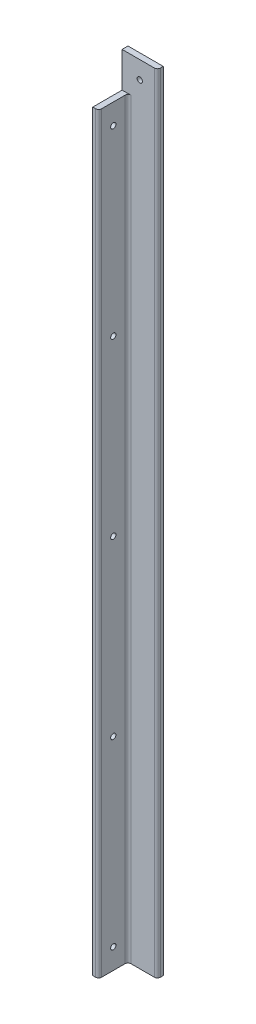
ISO-10303-21;
HEADER;
FILE_DESCRIPTION(('STEP AP214'),'2;1');
FILE_NAME('part.step','',(''),(''),'','','');
FILE_SCHEMA(('AUTOMOTIVE_DESIGN { 1 0 10303 214 1 1 1 1 }'));
ENDSEC;
DATA;
#1=APPLICATION_CONTEXT('core data for automotive mechanical design processes');
#2=APPLICATION_PROTOCOL_DEFINITION('international standard','automotive_design',2000,#1);
#3=PRODUCT_CONTEXT('',#1,'mechanical');
#4=PRODUCT('Part','Part','',(#3));
#5=PRODUCT_RELATED_PRODUCT_CATEGORY('part','',(#4));
#6=PRODUCT_DEFINITION_FORMATION('','',#4);
#7=PRODUCT_DEFINITION_CONTEXT('part definition',#1,'design');
#8=PRODUCT_DEFINITION('design','',#6,#7);
#9=PRODUCT_DEFINITION_SHAPE('','',#8);
#10=(LENGTH_UNIT() NAMED_UNIT(*) SI_UNIT(.MILLI.,.METRE.));
#11=(NAMED_UNIT(*) PLANE_ANGLE_UNIT() SI_UNIT($,.RADIAN.));
#12=(NAMED_UNIT(*) SI_UNIT($,.STERADIAN.) SOLID_ANGLE_UNIT());
#13=UNCERTAINTY_MEASURE_WITH_UNIT(LENGTH_MEASURE(1.E-05),#10,'distance_accuracy_value','');
#14=(GEOMETRIC_REPRESENTATION_CONTEXT(3) GLOBAL_UNCERTAINTY_ASSIGNED_CONTEXT((#13)) GLOBAL_UNIT_ASSIGNED_CONTEXT((#10,
#11,#12)) REPRESENTATION_CONTEXT('',''));
#15=CARTESIAN_POINT('',(0.,0.,0.));
#16=DIRECTION('',(0.,0.,1.));
#17=DIRECTION('',(1.,0.,0.));
#18=AXIS2_PLACEMENT_3D('',#15,#16,#17);
#19=CARTESIAN_POINT('',(0.,431.8,5.08));
#20=DIRECTION('',(1.,0.,0.));
#21=DIRECTION('',(0.,0.,1.));
#22=AXIS2_PLACEMENT_3D('',#19,#20,#21);
#23=PLANE('',#22);
#24=CARTESIAN_POINT('',(0.,109.5375,16.1925));
#25=DIRECTION('',(-1.,0.,0.));
#26=DIRECTION('',(0.,0.,1.));
#27=AXIS2_PLACEMENT_3D('',#24,#25,#26);
#28=CIRCLE('',#27,1.4224);
#29=CARTESIAN_POINT('',(0.,109.5375,17.6149));
#30=VERTEX_POINT('',#29);
#31=EDGE_CURVE('E155',#30,#30,#28,.T.);
#32=ORIENTED_EDGE('',*,*,#31,.F.);
#33=EDGE_LOOP('',(#32));
#34=FACE_BOUND('',#33,.T.);
#35=CARTESIAN_POINT('',(0.,395.2875,16.1925));
#36=DIRECTION('',(-1.,0.,0.));
#37=DIRECTION('',(0.,0.,1.));
#38=AXIS2_PLACEMENT_3D('',#35,#36,#37);
#39=CIRCLE('',#38,1.42239999999999);
#40=CARTESIAN_POINT('',(0.,395.2875,17.6149));
#41=VERTEX_POINT('',#40);
#42=EDGE_CURVE('E158',#41,#41,#39,.T.);
#43=ORIENTED_EDGE('',*,*,#42,.F.);
#44=EDGE_LOOP('',(#43));
#45=FACE_BOUND('',#44,.T.);
#46=CARTESIAN_POINT('',(0.,11.1125,16.1925));
#47=DIRECTION('',(-1.,0.,0.));
#48=DIRECTION('',(0.,0.,1.));
#49=AXIS2_PLACEMENT_3D('',#46,#47,#48);
#50=CIRCLE('',#49,1.4224);
#51=CARTESIAN_POINT('',(0.,11.1125,17.6149));
#52=VERTEX_POINT('',#51);
#53=EDGE_CURVE('E161',#52,#52,#50,.T.);
#54=ORIENTED_EDGE('',*,*,#53,.F.);
#55=EDGE_LOOP('',(#54));
#56=FACE_BOUND('',#55,.T.);
#57=CARTESIAN_POINT('',(0.,296.8625,16.1925));
#58=DIRECTION('',(-1.,0.,0.));
#59=DIRECTION('',(0.,0.,1.));
#60=AXIS2_PLACEMENT_3D('',#57,#58,#59);
#61=CIRCLE('',#60,1.42239999999999);
#62=CARTESIAN_POINT('',(0.,296.8625,17.6149));
#63=VERTEX_POINT('',#62);
#64=EDGE_CURVE('E164',#63,#63,#61,.T.);
#65=ORIENTED_EDGE('',*,*,#64,.F.);
#66=EDGE_LOOP('',(#65));
#67=FACE_BOUND('',#66,.T.);
#68=CARTESIAN_POINT('',(0.,203.2,16.1925));
#69=DIRECTION('',(-1.,0.,0.));
#70=DIRECTION('',(0.,0.,1.));
#71=AXIS2_PLACEMENT_3D('',#68,#69,#70);
#72=CIRCLE('',#71,1.4224);
#73=CARTESIAN_POINT('',(0.,203.2,17.6149));
#74=VERTEX_POINT('',#73);
#75=EDGE_CURVE('E167',#74,#74,#72,.T.);
#76=ORIENTED_EDGE('',*,*,#75,.F.);
#77=EDGE_LOOP('',(#76));
#78=FACE_BOUND('',#77,.T.);
#79=DIRECTION('',(0.,0.,-1.));
#80=VECTOR('',#79,1.);
#81=CARTESIAN_POINT('',(0.,425.45,8.255));
#82=LINE('',#81,#80);
#83=CARTESIAN_POINT('',(0.,425.45,8.255));
#84=VERTEX_POINT('',#83);
#85=CARTESIAN_POINT('',(0.,425.45,5.08));
#86=VERTEX_POINT('',#85);
#87=EDGE_CURVE('E118',#84,#86,#82,.T.);
#88=ORIENTED_EDGE('',*,*,#87,.T.);
#89=DIRECTION('',(0.,-1.,0.));
#90=VECTOR('',#89,1.);
#91=CARTESIAN_POINT('',(0.,431.8,5.08));
#92=LINE('',#91,#90);
#93=CARTESIAN_POINT('',(0.,0.,5.08));
#94=VERTEX_POINT('',#93);
#95=EDGE_CURVE('E11',#86,#94,#92,.T.);
#96=ORIENTED_EDGE('',*,*,#95,.T.);
#97=DIRECTION('',(0.,0.,-1.));
#98=VECTOR('',#97,1.);
#99=CARTESIAN_POINT('',(0.,0.,5.08));
#100=LINE('',#99,#98);
#101=CARTESIAN_POINT('',(0.,0.,24.13));
#102=VERTEX_POINT('',#101);
#103=EDGE_CURVE('E180',#102,#94,#100,.T.);
#104=ORIENTED_EDGE('',*,*,#103,.F.);
#105=DIRECTION('',(0.,-1.,0.));
#106=VECTOR('',#105,1.);
#107=CARTESIAN_POINT('',(0.,431.8,24.13));
#108=LINE('',#107,#106);
#109=CARTESIAN_POINT('',(0.,406.4,24.13));
#110=VERTEX_POINT('',#109);
#111=EDGE_CURVE('E203',#110,#102,#108,.T.);
#112=ORIENTED_EDGE('',*,*,#111,.F.);
#113=DIRECTION('',(0.,0.,1.));
#114=VECTOR('',#113,1.);
#115=CARTESIAN_POINT('',(0.,406.4,5.08));
#116=LINE('',#115,#114);
#117=CARTESIAN_POINT('',(0.,406.4,8.255));
#118=VERTEX_POINT('',#117);
#119=EDGE_CURVE('E125',#118,#110,#116,.T.);
#120=ORIENTED_EDGE('',*,*,#119,.F.);
#121=DIRECTION('',(0.,-1.,0.));
#122=VECTOR('',#121,1.);
#123=CARTESIAN_POINT('',(0.,431.8,8.255));
#124=LINE('',#123,#122);
#125=EDGE_CURVE('E113',#84,#118,#124,.T.);
#126=ORIENTED_EDGE('',*,*,#125,.F.);
#127=EDGE_LOOP('',(#88,#96,#104,#112,#120,#126));
#128=FACE_BOUND('',#127,.T.);
#129=ADVANCED_FACE('F34',(#34,#45,#56,#67,#78,#128),#23,.F.);
#130=CARTESIAN_POINT('',(0.,431.8,5.08));
#131=DIRECTION('',(0.,0.,1.));
#132=DIRECTION('',(-1.,0.,0.));
#133=AXIS2_PLACEMENT_3D('',#130,#131,#132);
#134=PLANE('',#133);
#135=CARTESIAN_POINT('',(9.525,415.925,5.08));
#136=DIRECTION('',(0.,0.,-1.));
#137=DIRECTION('',(-1.,0.,0.));
#138=AXIS2_PLACEMENT_3D('',#135,#136,#137);
#139=CIRCLE('',#138,1.42239999999999);
#140=CARTESIAN_POINT('',(8.10260000000001,415.925,5.08));
#141=VERTEX_POINT('',#140);
#142=EDGE_CURVE('E242',#141,#141,#139,.T.);
#143=ORIENTED_EDGE('',*,*,#142,.F.);
#144=EDGE_LOOP('',(#143));
#145=FACE_BOUND('',#144,.T.);
#146=DIRECTION('',(1.,0.,0.));
#147=VECTOR('',#146,1.);
#148=CARTESIAN_POINT('',(0.,425.45,5.08));
#149=LINE('',#148,#147);
#150=CARTESIAN_POINT('',(19.05,425.45,5.08));
#151=VERTEX_POINT('',#150);
#152=EDGE_CURVE('E131',#86,#151,#149,.T.);
#153=ORIENTED_EDGE('',*,*,#152,.T.);
#154=DIRECTION('',(0.,-1.,0.));
#155=VECTOR('',#154,1.);
#156=CARTESIAN_POINT('',(19.05,431.8,5.08));
#157=LINE('',#156,#155);
#158=CARTESIAN_POINT('',(19.05,0.,5.08));
#159=VERTEX_POINT('',#158);
#160=EDGE_CURVE('E41',#151,#159,#157,.T.);
#161=ORIENTED_EDGE('',*,*,#160,.T.);
#162=DIRECTION('',(1.,0.,0.));
#163=VECTOR('',#162,1.);
#164=CARTESIAN_POINT('',(0.,0.,5.08));
#165=LINE('',#164,#163);
#166=EDGE_CURVE('E182',#94,#159,#165,.T.);
#167=ORIENTED_EDGE('',*,*,#166,.F.);
#168=ORIENTED_EDGE('',*,*,#95,.F.);
#169=EDGE_LOOP('',(#153,#161,#167,#168));
#170=FACE_BOUND('',#169,.T.);
#171=ADVANCED_FACE('F223',(#145,#170),#134,.F.);
#172=CARTESIAN_POINT('',(19.05,431.8,6.66749999999999));
#173=DIRECTION('',(-1.,0.,0.));
#174=DIRECTION('',(0.,0.,-1.));
#175=AXIS2_PLACEMENT_3D('',#172,#173,#174);
#176=PLANE('',#175);
#177=DIRECTION('',(0.,0.,1.));
#178=VECTOR('',#177,1.);
#179=CARTESIAN_POINT('',(19.05,425.45,5.08));
#180=LINE('',#179,#178);
#181=CARTESIAN_POINT('',(19.05,425.45,6.66749999999999));
#182=VERTEX_POINT('',#181);
#183=EDGE_CURVE('E134',#151,#182,#180,.T.);
#184=ORIENTED_EDGE('',*,*,#183,.T.);
#185=DIRECTION('',(0.,-1.,0.));
#186=VECTOR('',#185,1.);
#187=CARTESIAN_POINT('',(19.05,431.8,6.66749999999999));
#188=LINE('',#187,#186);
#189=CARTESIAN_POINT('',(19.05,0.,6.66749999999999));
#190=VERTEX_POINT('',#189);
#191=EDGE_CURVE('E218',#182,#190,#188,.T.);
#192=ORIENTED_EDGE('',*,*,#191,.T.);
#193=DIRECTION('',(0.,0.,1.));
#194=VECTOR('',#193,1.);
#195=CARTESIAN_POINT('',(19.05,0.,6.66749999999999));
#196=LINE('',#195,#194);
#197=EDGE_CURVE('E185',#159,#190,#196,.T.);
#198=ORIENTED_EDGE('',*,*,#197,.F.);
#199=ORIENTED_EDGE('',*,*,#160,.F.);
#200=EDGE_LOOP('',(#184,#192,#198,#199));
#201=FACE_BOUND('',#200,.T.);
#202=ADVANCED_FACE('F225',(#201),#176,.F.);
#203=CARTESIAN_POINT('',(17.4625,431.8,6.6675));
#204=DIRECTION('',(0.,-1.,0.));
#205=DIRECTION('',(0.,0.,1.));
#206=AXIS2_PLACEMENT_3D('',#203,#204,#205);
#207=CYLINDRICAL_SURFACE('',#206,1.5875);
#208=CARTESIAN_POINT('',(17.4625,425.45,6.6675));
#209=DIRECTION('',(0.,-1.,0.));
#210=DIRECTION('',(0.,0.,-1.));
#211=AXIS2_PLACEMENT_3D('',#208,#209,#210);
#212=CIRCLE('',#211,1.5875);
#213=CARTESIAN_POINT('',(17.4625,425.45,8.255));
#214=VERTEX_POINT('',#213);
#215=EDGE_CURVE('E119',#182,#214,#212,.T.);
#216=ORIENTED_EDGE('',*,*,#215,.T.);
#217=DIRECTION('',(0.,-1.,0.));
#218=VECTOR('',#217,1.);
#219=CARTESIAN_POINT('',(17.4625,431.8,8.255));
#220=LINE('',#219,#218);
#221=CARTESIAN_POINT('',(17.4625,0.,8.255));
#222=VERTEX_POINT('',#221);
#223=EDGE_CURVE('E116',#214,#222,#220,.T.);
#224=ORIENTED_EDGE('',*,*,#223,.T.);
#225=CARTESIAN_POINT('',(17.4625,0.,6.6675));
#226=DIRECTION('',(0.,-1.,0.));
#227=DIRECTION('',(0.,0.,1.));
#228=AXIS2_PLACEMENT_3D('',#225,#226,#227);
#229=CIRCLE('',#228,1.5875);
#230=EDGE_CURVE('E188',#190,#222,#229,.T.);
#231=ORIENTED_EDGE('',*,*,#230,.F.);
#232=ORIENTED_EDGE('',*,*,#191,.F.);
#233=EDGE_LOOP('',(#216,#224,#231,#232));
#234=FACE_BOUND('',#233,.T.);
#235=ADVANCED_FACE('F241',(#234),#207,.T.);
#236=CARTESIAN_POINT('',(4.76250000000001,431.8,8.255));
#237=DIRECTION('',(0.,0.,-1.));
#238=DIRECTION('',(1.,0.,0.));
#239=AXIS2_PLACEMENT_3D('',#236,#237,#238);
#240=PLANE('',#239);
#241=CARTESIAN_POINT('',(9.525,415.925,8.255));
#242=DIRECTION('',(0.,0.,-1.));
#243=DIRECTION('',(-1.,0.,0.));
#244=AXIS2_PLACEMENT_3D('',#241,#242,#243);
#245=CIRCLE('',#244,1.42239999999999);
#246=CARTESIAN_POINT('',(8.10260000000001,415.925,8.255));
#247=VERTEX_POINT('',#246);
#248=EDGE_CURVE('E244',#247,#247,#245,.T.);
#249=ORIENTED_EDGE('',*,*,#248,.T.);
#250=EDGE_LOOP('',(#249));
#251=FACE_BOUND('',#250,.T.);
#252=DIRECTION('',(-1.,0.,0.));
#253=VECTOR('',#252,1.);
#254=CARTESIAN_POINT('',(17.4625,425.45,8.255));
#255=LINE('',#254,#253);
#256=EDGE_CURVE('E48',#214,#84,#255,.T.);
#257=ORIENTED_EDGE('',*,*,#256,.T.);
#258=ORIENTED_EDGE('',*,*,#125,.T.);
#259=DIRECTION('',(1.,0.,0.));
#260=VECTOR('',#259,1.);
#261=CARTESIAN_POINT('',(-3.175,406.4,8.255));
#262=LINE('',#261,#260);
#263=CARTESIAN_POINT('',(4.7625,406.4,8.255));
#264=VERTEX_POINT('',#263);
#265=EDGE_CURVE('E175',#118,#264,#262,.T.);
#266=ORIENTED_EDGE('',*,*,#265,.T.);
#267=DIRECTION('',(0.,-1.,0.));
#268=VECTOR('',#267,1.);
#269=CARTESIAN_POINT('',(4.76250000000001,431.8,8.255));
#270=LINE('',#269,#268);
#271=CARTESIAN_POINT('',(4.76250000000001,0.,8.255));
#272=VERTEX_POINT('',#271);
#273=EDGE_CURVE('E214',#264,#272,#270,.T.);
#274=ORIENTED_EDGE('',*,*,#273,.T.);
#275=DIRECTION('',(-1.,0.,0.));
#276=VECTOR('',#275,1.);
#277=CARTESIAN_POINT('',(4.76250000000001,0.,8.255));
#278=LINE('',#277,#276);
#279=EDGE_CURVE('E191',#222,#272,#278,.T.);
#280=ORIENTED_EDGE('',*,*,#279,.F.);
#281=ORIENTED_EDGE('',*,*,#223,.F.);
#282=EDGE_LOOP('',(#257,#258,#266,#274,#280,#281));
#283=FACE_BOUND('',#282,.T.);
#284=ADVANCED_FACE('F111',(#251,#283),#240,.F.);
#285=CARTESIAN_POINT('',(4.7625,431.8,9.8425));
#286=DIRECTION('',(0.,-1.,0.));
#287=DIRECTION('',(0.,0.,1.));
#288=AXIS2_PLACEMENT_3D('',#285,#286,#287);
#289=CYLINDRICAL_SURFACE('',#288,1.5875);
#290=DIRECTION('',(0.,-1.,0.));
#291=VECTOR('',#290,1.);
#292=CARTESIAN_POINT('',(3.175,431.8,9.84250000000001));
#293=LINE('',#292,#291);
#294=CARTESIAN_POINT('',(3.175,406.4,9.84250000000001));
#295=VERTEX_POINT('',#294);
#296=CARTESIAN_POINT('',(3.175,0.,9.84250000000001));
#297=VERTEX_POINT('',#296);
#298=EDGE_CURVE('E211',#295,#297,#293,.T.);
#299=ORIENTED_EDGE('',*,*,#298,.T.);
#300=CARTESIAN_POINT('',(4.7625,0.,9.8425));
#301=DIRECTION('',(0.,1.,0.));
#302=DIRECTION('',(0.,0.,-1.));
#303=AXIS2_PLACEMENT_3D('',#300,#301,#302);
#304=CIRCLE('',#303,1.5875);
#305=EDGE_CURVE('E194',#272,#297,#304,.T.);
#306=ORIENTED_EDGE('',*,*,#305,.F.);
#307=ORIENTED_EDGE('',*,*,#273,.F.);
#308=CARTESIAN_POINT('',(4.7625,406.4,9.8425));
#309=DIRECTION('',(0.,1.,0.));
#310=DIRECTION('',(0.,0.,1.));
#311=AXIS2_PLACEMENT_3D('',#308,#309,#310);
#312=CIRCLE('',#311,1.5875);
#313=EDGE_CURVE('E170',#295,#264,#312,.F.);
#314=ORIENTED_EDGE('',*,*,#313,.F.);
#315=EDGE_LOOP('',(#299,#306,#307,#314));
#316=FACE_BOUND('',#315,.T.);
#317=ADVANCED_FACE('F238',(#316),#289,.F.);
#318=CARTESIAN_POINT('',(3.175,431.8,9.84250000000001));
#319=DIRECTION('',(-1.,0.,0.));
#320=DIRECTION('',(0.,0.,-1.));
#321=AXIS2_PLACEMENT_3D('',#318,#319,#320);
#322=PLANE('',#321);
#323=CARTESIAN_POINT('',(3.175,203.2,16.1925));
#324=DIRECTION('',(-1.,0.,0.));
#325=DIRECTION('',(0.,0.,1.));
#326=AXIS2_PLACEMENT_3D('',#323,#324,#325);
#327=CIRCLE('',#326,1.4224);
#328=CARTESIAN_POINT('',(3.175,203.2,17.6149));
#329=VERTEX_POINT('',#328);
#330=EDGE_CURVE('E147',#329,#329,#327,.T.);
#331=ORIENTED_EDGE('',*,*,#330,.T.);
#332=EDGE_LOOP('',(#331));
#333=FACE_BOUND('',#332,.T.);
#334=CARTESIAN_POINT('',(3.175,296.8625,16.1925));
#335=DIRECTION('',(-1.,0.,0.));
#336=DIRECTION('',(0.,0.,1.));
#337=AXIS2_PLACEMENT_3D('',#334,#335,#336);
#338=CIRCLE('',#337,1.42239999999999);
#339=CARTESIAN_POINT('',(3.175,296.8625,17.6149));
#340=VERTEX_POINT('',#339);
#341=EDGE_CURVE('E144',#340,#340,#338,.T.);
#342=ORIENTED_EDGE('',*,*,#341,.T.);
#343=EDGE_LOOP('',(#342));
#344=FACE_BOUND('',#343,.T.);
#345=CARTESIAN_POINT('',(3.175,11.1125,16.1925));
#346=DIRECTION('',(-1.,0.,0.));
#347=DIRECTION('',(0.,0.,1.));
#348=AXIS2_PLACEMENT_3D('',#345,#346,#347);
#349=CIRCLE('',#348,1.4224);
#350=CARTESIAN_POINT('',(3.175,11.1125,17.6149));
#351=VERTEX_POINT('',#350);
#352=EDGE_CURVE('E141',#351,#351,#349,.T.);
#353=ORIENTED_EDGE('',*,*,#352,.T.);
#354=EDGE_LOOP('',(#353));
#355=FACE_BOUND('',#354,.T.);
#356=CARTESIAN_POINT('',(3.175,395.2875,16.1925));
#357=DIRECTION('',(-1.,0.,0.));
#358=DIRECTION('',(0.,0.,1.));
#359=AXIS2_PLACEMENT_3D('',#356,#357,#358);
#360=CIRCLE('',#359,1.42239999999999);
#361=CARTESIAN_POINT('',(3.175,395.2875,17.6149));
#362=VERTEX_POINT('',#361);
#363=EDGE_CURVE('E140',#362,#362,#360,.T.);
#364=ORIENTED_EDGE('',*,*,#363,.T.);
#365=EDGE_LOOP('',(#364));
#366=FACE_BOUND('',#365,.T.);
#367=CARTESIAN_POINT('',(3.175,109.5375,16.1925));
#368=DIRECTION('',(-1.,0.,0.));
#369=DIRECTION('',(0.,0.,1.));
#370=AXIS2_PLACEMENT_3D('',#367,#368,#369);
#371=CIRCLE('',#370,1.4224);
#372=CARTESIAN_POINT('',(3.175,109.5375,17.6149));
#373=VERTEX_POINT('',#372);
#374=EDGE_CURVE('E150',#373,#373,#371,.T.);
#375=ORIENTED_EDGE('',*,*,#374,.T.);
#376=EDGE_LOOP('',(#375));
#377=FACE_BOUND('',#376,.T.);
#378=DIRECTION('',(0.,-1.,0.));
#379=VECTOR('',#378,1.);
#380=CARTESIAN_POINT('',(3.175,431.8,22.5425));
#381=LINE('',#380,#379);
#382=CARTESIAN_POINT('',(3.175,406.4,22.5425));
#383=VERTEX_POINT('',#382);
#384=CARTESIAN_POINT('',(3.175,0.,22.5425));
#385=VERTEX_POINT('',#384);
#386=EDGE_CURVE('E208',#383,#385,#381,.T.);
#387=ORIENTED_EDGE('',*,*,#386,.T.);
#388=DIRECTION('',(0.,0.,1.));
#389=VECTOR('',#388,1.);
#390=CARTESIAN_POINT('',(3.175,0.,9.84250000000001));
#391=LINE('',#390,#389);
#392=EDGE_CURVE('E197',#297,#385,#391,.T.);
#393=ORIENTED_EDGE('',*,*,#392,.F.);
#394=ORIENTED_EDGE('',*,*,#298,.F.);
#395=DIRECTION('',(0.,0.,1.));
#396=VECTOR('',#395,1.);
#397=CARTESIAN_POINT('',(3.175,406.4,24.13));
#398=LINE('',#397,#396);
#399=EDGE_CURVE('E172',#295,#383,#398,.T.);
#400=ORIENTED_EDGE('',*,*,#399,.T.);
#401=EDGE_LOOP('',(#387,#393,#394,#400));
#402=FACE_BOUND('',#401,.T.);
#403=ADVANCED_FACE('F271',(#333,#344,#355,#366,#377,#402),#322,.F.);
#404=CARTESIAN_POINT('',(1.5875,431.8,22.5425));
#405=DIRECTION('',(0.,-1.,0.));
#406=DIRECTION('',(0.,0.,1.));
#407=AXIS2_PLACEMENT_3D('',#404,#405,#406);
#408=CYLINDRICAL_SURFACE('',#407,1.5875);
#409=DIRECTION('',(0.,-1.,0.));
#410=VECTOR('',#409,1.);
#411=CARTESIAN_POINT('',(1.58749999999999,431.8,24.13));
#412=LINE('',#411,#410);
#413=CARTESIAN_POINT('',(1.58749999999999,406.4,24.13));
#414=VERTEX_POINT('',#413);
#415=CARTESIAN_POINT('',(1.58749999999999,0.,24.13));
#416=VERTEX_POINT('',#415);
#417=EDGE_CURVE('E205',#414,#416,#412,.T.);
#418=ORIENTED_EDGE('',*,*,#417,.T.);
#419=CARTESIAN_POINT('',(1.5875,0.,22.5425));
#420=DIRECTION('',(0.,-1.,0.));
#421=DIRECTION('',(0.,0.,-1.));
#422=AXIS2_PLACEMENT_3D('',#419,#420,#421);
#423=CIRCLE('',#422,1.5875);
#424=EDGE_CURVE('E200',#385,#416,#423,.T.);
#425=ORIENTED_EDGE('',*,*,#424,.F.);
#426=ORIENTED_EDGE('',*,*,#386,.F.);
#427=CARTESIAN_POINT('',(1.5875,406.4,22.5425));
#428=DIRECTION('',(0.,1.,0.));
#429=DIRECTION('',(0.,0.,1.));
#430=AXIS2_PLACEMENT_3D('',#427,#428,#429);
#431=CIRCLE('',#430,1.5875);
#432=EDGE_CURVE('E126',#414,#383,#431,.T.);
#433=ORIENTED_EDGE('',*,*,#432,.F.);
#434=EDGE_LOOP('',(#418,#425,#426,#433));
#435=FACE_BOUND('',#434,.T.);
#436=ADVANCED_FACE('F274',(#435),#408,.T.);
#437=CARTESIAN_POINT('',(0.,431.8,24.13));
#438=DIRECTION('',(0.,0.,-1.));
#439=DIRECTION('',(1.,0.,0.));
#440=AXIS2_PLACEMENT_3D('',#437,#438,#439);
#441=PLANE('',#440);
#442=ORIENTED_EDGE('',*,*,#111,.T.);
#443=DIRECTION('',(-1.,0.,0.));
#444=VECTOR('',#443,1.);
#445=CARTESIAN_POINT('',(0.,0.,24.13));
#446=LINE('',#445,#444);
#447=EDGE_CURVE('E56',#416,#102,#446,.T.);
#448=ORIENTED_EDGE('',*,*,#447,.F.);
#449=ORIENTED_EDGE('',*,*,#417,.F.);
#450=DIRECTION('',(1.,0.,0.));
#451=VECTOR('',#450,1.);
#452=CARTESIAN_POINT('',(-3.175,406.4,24.13));
#453=LINE('',#452,#451);
#454=EDGE_CURVE('E127',#110,#414,#453,.T.);
#455=ORIENTED_EDGE('',*,*,#454,.F.);
#456=EDGE_LOOP('',(#442,#448,#449,#455));
#457=FACE_BOUND('',#456,.T.);
#458=ADVANCED_FACE('F230',(#457),#441,.F.);
#459=CARTESIAN_POINT('',(1.5875,0.,22.5425));
#460=DIRECTION('',(0.,1.,0.));
#461=DIRECTION('',(0.,0.,-1.));
#462=AXIS2_PLACEMENT_3D('',#459,#460,#461);
#463=PLANE('',#462);
#464=ORIENTED_EDGE('',*,*,#103,.T.);
#465=ORIENTED_EDGE('',*,*,#166,.T.);
#466=ORIENTED_EDGE('',*,*,#197,.T.);
#467=ORIENTED_EDGE('',*,*,#230,.T.);
#468=ORIENTED_EDGE('',*,*,#279,.T.);
#469=ORIENTED_EDGE('',*,*,#305,.T.);
#470=ORIENTED_EDGE('',*,*,#392,.T.);
#471=ORIENTED_EDGE('',*,*,#424,.T.);
#472=ORIENTED_EDGE('',*,*,#447,.T.);
#473=EDGE_LOOP('',(#464,#465,#466,#467,#468,#469,#470,#471,#472));
#474=FACE_BOUND('',#473,.T.);
#475=ADVANCED_FACE('F227',(#474),#463,.F.);
#476=CARTESIAN_POINT('',(-3.175,406.4,24.13));
#477=DIRECTION('',(0.,-1.,0.));
#478=DIRECTION('',(0.,0.,1.));
#479=AXIS2_PLACEMENT_3D('',#476,#477,#478);
#480=PLANE('',#479);
#481=ORIENTED_EDGE('',*,*,#265,.F.);
#482=ORIENTED_EDGE('',*,*,#119,.T.);
#483=ORIENTED_EDGE('',*,*,#454,.T.);
#484=ORIENTED_EDGE('',*,*,#432,.T.);
#485=ORIENTED_EDGE('',*,*,#399,.F.);
#486=ORIENTED_EDGE('',*,*,#313,.T.);
#487=EDGE_LOOP('',(#481,#482,#483,#484,#485,#486));
#488=FACE_BOUND('',#487,.T.);
#489=ADVANCED_FACE('F234',(#488),#480,.F.);
#490=CARTESIAN_POINT('',(-1.905,109.5375,16.1925));
#491=DIRECTION('',(1.,0.,0.));
#492=DIRECTION('',(0.,0.,1.));
#493=AXIS2_PLACEMENT_3D('',#490,#491,#492);
#494=CYLINDRICAL_SURFACE('',#493,1.4224);
#495=ORIENTED_EDGE('',*,*,#374,.F.);
#496=EDGE_LOOP('',(#495));
#497=FACE_BOUND('',#496,.T.);
#498=ORIENTED_EDGE('',*,*,#31,.T.);
#499=EDGE_LOOP('',(#498));
#500=FACE_BOUND('',#499,.T.);
#501=ADVANCED_FACE('F285',(#497,#500),#494,.F.);
#502=CARTESIAN_POINT('',(-1.905,395.2875,16.1925));
#503=DIRECTION('',(1.,0.,0.));
#504=DIRECTION('',(0.,0.,1.));
#505=AXIS2_PLACEMENT_3D('',#502,#503,#504);
#506=CYLINDRICAL_SURFACE('',#505,1.42239999999999);
#507=ORIENTED_EDGE('',*,*,#363,.F.);
#508=EDGE_LOOP('',(#507));
#509=FACE_BOUND('',#508,.T.);
#510=ORIENTED_EDGE('',*,*,#42,.T.);
#511=EDGE_LOOP('',(#510));
#512=FACE_BOUND('',#511,.T.);
#513=ADVANCED_FACE('F288',(#509,#512),#506,.F.);
#514=CARTESIAN_POINT('',(-1.905,11.1125,16.1925));
#515=DIRECTION('',(1.,0.,0.));
#516=DIRECTION('',(0.,0.,1.));
#517=AXIS2_PLACEMENT_3D('',#514,#515,#516);
#518=CYLINDRICAL_SURFACE('',#517,1.4224);
#519=ORIENTED_EDGE('',*,*,#352,.F.);
#520=EDGE_LOOP('',(#519));
#521=FACE_BOUND('',#520,.T.);
#522=ORIENTED_EDGE('',*,*,#53,.T.);
#523=EDGE_LOOP('',(#522));
#524=FACE_BOUND('',#523,.T.);
#525=ADVANCED_FACE('F294',(#521,#524),#518,.F.);
#526=CARTESIAN_POINT('',(-1.905,296.8625,16.1925));
#527=DIRECTION('',(1.,0.,0.));
#528=DIRECTION('',(0.,0.,1.));
#529=AXIS2_PLACEMENT_3D('',#526,#527,#528);
#530=CYLINDRICAL_SURFACE('',#529,1.42239999999999);
#531=ORIENTED_EDGE('',*,*,#341,.F.);
#532=EDGE_LOOP('',(#531));
#533=FACE_BOUND('',#532,.T.);
#534=ORIENTED_EDGE('',*,*,#64,.T.);
#535=EDGE_LOOP('',(#534));
#536=FACE_BOUND('',#535,.T.);
#537=ADVANCED_FACE('F290',(#533,#536),#530,.F.);
#538=CARTESIAN_POINT('',(-1.905,203.2,16.1925));
#539=DIRECTION('',(1.,0.,0.));
#540=DIRECTION('',(0.,0.,1.));
#541=AXIS2_PLACEMENT_3D('',#538,#539,#540);
#542=CYLINDRICAL_SURFACE('',#541,1.4224);
#543=ORIENTED_EDGE('',*,*,#330,.F.);
#544=EDGE_LOOP('',(#543));
#545=FACE_BOUND('',#544,.T.);
#546=ORIENTED_EDGE('',*,*,#75,.T.);
#547=EDGE_LOOP('',(#546));
#548=FACE_BOUND('',#547,.T.);
#549=ADVANCED_FACE('F293',(#545,#548),#542,.F.);
#550=CARTESIAN_POINT('',(17.4625,425.45,6.6675));
#551=DIRECTION('',(0.,1.,0.));
#552=DIRECTION('',(0.,0.,-1.));
#553=AXIS2_PLACEMENT_3D('',#550,#551,#552);
#554=PLANE('',#553);
#555=ORIENTED_EDGE('',*,*,#215,.F.);
#556=ORIENTED_EDGE('',*,*,#183,.F.);
#557=ORIENTED_EDGE('',*,*,#152,.F.);
#558=ORIENTED_EDGE('',*,*,#87,.F.);
#559=ORIENTED_EDGE('',*,*,#256,.F.);
#560=EDGE_LOOP('',(#555,#556,#557,#558,#559));
#561=FACE_BOUND('',#560,.T.);
#562=ADVANCED_FACE('F129',(#561),#554,.T.);
#563=CARTESIAN_POINT('',(9.525,415.925,3.175));
#564=DIRECTION('',(0.,0.,1.));
#565=DIRECTION('',(-1.,0.,0.));
#566=AXIS2_PLACEMENT_3D('',#563,#564,#565);
#567=CYLINDRICAL_SURFACE('',#566,1.42239999999999);
#568=ORIENTED_EDGE('',*,*,#248,.F.);
#569=EDGE_LOOP('',(#568));
#570=FACE_BOUND('',#569,.T.);
#571=ORIENTED_EDGE('',*,*,#142,.T.);
#572=EDGE_LOOP('',(#571));
#573=FACE_BOUND('',#572,.T.);
#574=ADVANCED_FACE('F251',(#570,#573),#567,.F.);
#575=CLOSED_SHELL('',(#129,#171,#202,#235,#284,#317,#403,#436,#458,#475,#489,#501,#513,#525,
#537,#549,#562,#574));
#576=MANIFOLD_SOLID_BREP('B2',#575);
#577=ADVANCED_BREP_SHAPE_REPRESENTATION('',(#18,#576),#14);
#578=SHAPE_DEFINITION_REPRESENTATION(#9,#577);
ENDSEC;
END-ISO-10303-21;
